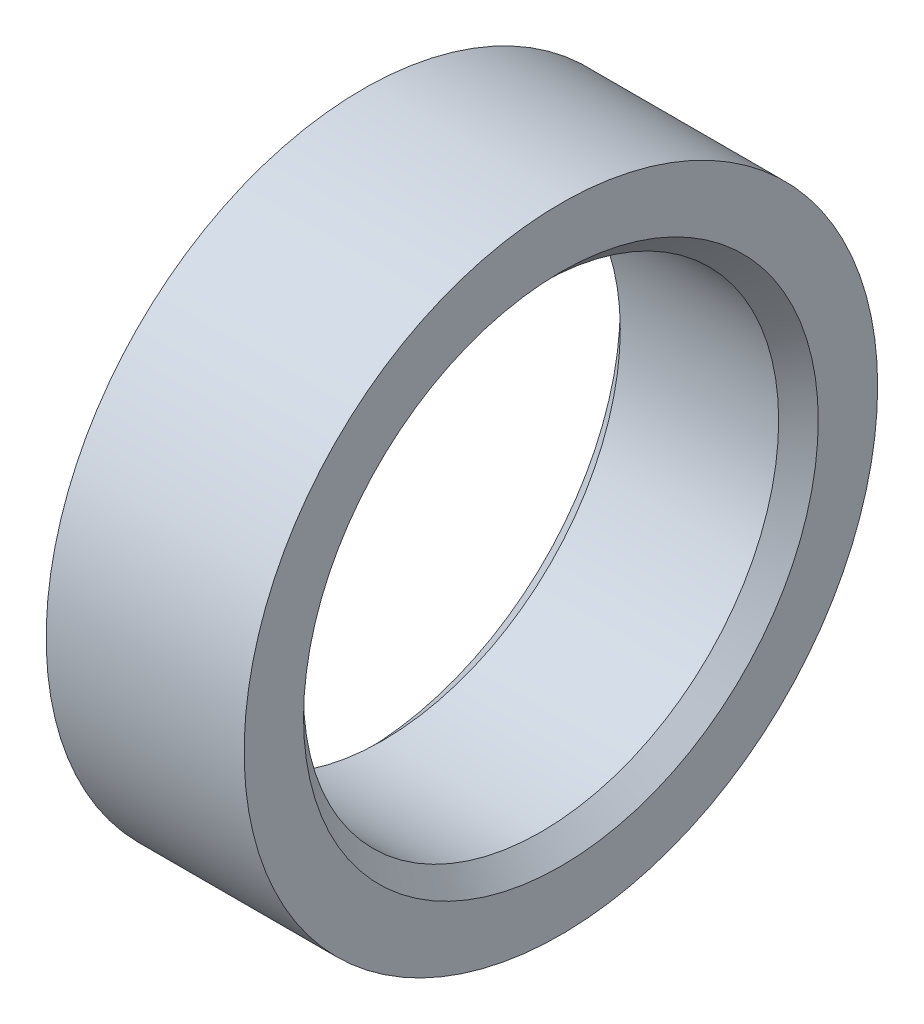
ISO-10303-21;
HEADER;
FILE_DESCRIPTION(('STEP AP214'),'2;1');
FILE_NAME('part.step','',(''),(''),'','','');
FILE_SCHEMA(('AUTOMOTIVE_DESIGN { 1 0 10303 214 1 1 1 1 }'));
ENDSEC;
DATA;
#1=APPLICATION_CONTEXT('core data for automotive mechanical design processes');
#2=APPLICATION_PROTOCOL_DEFINITION('international standard','automotive_design',2000,#1);
#3=PRODUCT_CONTEXT('',#1,'mechanical');
#4=PRODUCT('Part','Part','',(#3));
#5=PRODUCT_RELATED_PRODUCT_CATEGORY('part','',(#4));
#6=PRODUCT_DEFINITION_FORMATION('','',#4);
#7=PRODUCT_DEFINITION_CONTEXT('part definition',#1,'design');
#8=PRODUCT_DEFINITION('design','',#6,#7);
#9=PRODUCT_DEFINITION_SHAPE('','',#8);
#10=(LENGTH_UNIT() NAMED_UNIT(*) SI_UNIT(.MILLI.,.METRE.));
#11=(NAMED_UNIT(*) PLANE_ANGLE_UNIT() SI_UNIT($,.RADIAN.));
#12=(NAMED_UNIT(*) SI_UNIT($,.STERADIAN.) SOLID_ANGLE_UNIT());
#13=UNCERTAINTY_MEASURE_WITH_UNIT(LENGTH_MEASURE(1.E-05),#10,'distance_accuracy_value','');
#14=(GEOMETRIC_REPRESENTATION_CONTEXT(3) GLOBAL_UNCERTAINTY_ASSIGNED_CONTEXT((#13)) GLOBAL_UNIT_ASSIGNED_CONTEXT((#10,
#11,#12)) REPRESENTATION_CONTEXT('',''));
#15=CARTESIAN_POINT('',(0.,0.,0.));
#16=DIRECTION('',(0.,0.,1.));
#17=DIRECTION('',(1.,0.,0.));
#18=AXIS2_PLACEMENT_3D('',#15,#16,#17);
#19=CARTESIAN_POINT('',(5.,0.,0.));
#20=DIRECTION('',(1.,0.,0.));
#21=DIRECTION('',(0.,0.,-1.));
#22=AXIS2_PLACEMENT_3D('',#19,#20,#21);
#23=PLANE('',#22);
#24=CARTESIAN_POINT('',(5.,0.,0.));
#25=DIRECTION('',(1.,0.,0.));
#26=DIRECTION('',(0.,0.,-1.));
#27=AXIS2_PLACEMENT_3D('',#24,#25,#26);
#28=CIRCLE('',#27,6.5);
#29=CARTESIAN_POINT('',(5.,0.,-6.5));
#30=VERTEX_POINT('',#29);
#31=EDGE_CURVE('E10',#30,#30,#28,.F.);
#32=ORIENTED_EDGE('',*,*,#31,.T.);
#33=EDGE_LOOP('',(#32));
#34=FACE_BOUND('',#33,.T.);
#35=CARTESIAN_POINT('',(5.,0.,0.));
#36=DIRECTION('',(1.,0.,0.));
#37=DIRECTION('',(0.,0.,-1.));
#38=AXIS2_PLACEMENT_3D('',#35,#36,#37);
#39=CIRCLE('',#38,8.);
#40=CARTESIAN_POINT('',(5.,0.,-8.));
#41=VERTEX_POINT('',#40);
#42=EDGE_CURVE('E51',#41,#41,#39,.T.);
#43=ORIENTED_EDGE('',*,*,#42,.T.);
#44=EDGE_LOOP('',(#43));
#45=FACE_BOUND('',#44,.T.);
#46=ADVANCED_FACE('F31',(#34,#45),#23,.T.);
#47=CARTESIAN_POINT('',(0.,0.,0.));
#48=DIRECTION('',(1.,0.,0.));
#49=DIRECTION('',(0.,0.,-1.));
#50=AXIS2_PLACEMENT_3D('',#47,#48,#49);
#51=PLANE('',#50);
#52=CARTESIAN_POINT('',(0.,0.,0.));
#53=DIRECTION('',(1.,0.,0.));
#54=DIRECTION('',(0.,0.,-1.));
#55=AXIS2_PLACEMENT_3D('',#52,#53,#54);
#56=CIRCLE('',#55,6.5);
#57=CARTESIAN_POINT('',(0.,0.,-6.5));
#58=VERTEX_POINT('',#57);
#59=EDGE_CURVE('E46',#58,#58,#56,.T.);
#60=ORIENTED_EDGE('',*,*,#59,.T.);
#61=EDGE_LOOP('',(#60));
#62=FACE_BOUND('',#61,.T.);
#63=CARTESIAN_POINT('',(0.,0.,0.));
#64=DIRECTION('',(1.,0.,0.));
#65=DIRECTION('',(0.,0.,-1.));
#66=AXIS2_PLACEMENT_3D('',#63,#64,#65);
#67=CIRCLE('',#66,8.);
#68=CARTESIAN_POINT('',(0.,0.,-8.));
#69=VERTEX_POINT('',#68);
#70=EDGE_CURVE('E52',#69,#69,#67,.T.);
#71=ORIENTED_EDGE('',*,*,#70,.F.);
#72=EDGE_LOOP('',(#71));
#73=FACE_BOUND('',#72,.T.);
#74=ADVANCED_FACE('F63',(#62,#73),#51,.F.);
#75=CARTESIAN_POINT('',(5.,0.,0.));
#76=DIRECTION('',(-1.,0.,0.));
#77=DIRECTION('',(0.,0.,1.));
#78=AXIS2_PLACEMENT_3D('',#75,#76,#77);
#79=CYLINDRICAL_SURFACE('',#78,8.);
#80=ORIENTED_EDGE('',*,*,#42,.F.);
#81=EDGE_LOOP('',(#80));
#82=FACE_BOUND('',#81,.T.);
#83=ORIENTED_EDGE('',*,*,#70,.T.);
#84=EDGE_LOOP('',(#83));
#85=FACE_BOUND('',#84,.T.);
#86=ADVANCED_FACE('F59',(#82,#85),#79,.T.);
#87=CARTESIAN_POINT('',(5.,0.,0.));
#88=DIRECTION('',(-1.,0.,0.));
#89=DIRECTION('',(0.,0.,1.));
#90=AXIS2_PLACEMENT_3D('',#87,#88,#89);
#91=CYLINDRICAL_SURFACE('',#90,6.);
#92=CARTESIAN_POINT('',(0.500000000000002,0.,0.));
#93=DIRECTION('',(1.,0.,0.));
#94=DIRECTION('',(0.,0.,-1.));
#95=AXIS2_PLACEMENT_3D('',#92,#93,#94);
#96=CIRCLE('',#95,6.);
#97=CARTESIAN_POINT('',(0.500000000000002,0.,-6.));
#98=VERTEX_POINT('',#97);
#99=EDGE_CURVE('E38',#98,#98,#96,.F.);
#100=ORIENTED_EDGE('',*,*,#99,.T.);
#101=EDGE_LOOP('',(#100));
#102=FACE_BOUND('',#101,.T.);
#103=CARTESIAN_POINT('',(4.5,0.,0.));
#104=DIRECTION('',(1.,0.,0.));
#105=DIRECTION('',(0.,0.,-1.));
#106=AXIS2_PLACEMENT_3D('',#103,#104,#105);
#107=CIRCLE('',#106,6.);
#108=CARTESIAN_POINT('',(4.5,0.,-6.));
#109=VERTEX_POINT('',#108);
#110=EDGE_CURVE('E42',#109,#109,#107,.T.);
#111=ORIENTED_EDGE('',*,*,#110,.T.);
#112=EDGE_LOOP('',(#111));
#113=FACE_BOUND('',#112,.T.);
#114=ADVANCED_FACE('F62',(#102,#113),#91,.F.);
#115=CARTESIAN_POINT('',(0.,0.,0.));
#116=DIRECTION('',(-1.,0.,0.));
#117=DIRECTION('',(0.,0.,1.));
#118=AXIS2_PLACEMENT_3D('',#115,#116,#117);
#119=CONICAL_SURFACE('',#118,6.5,0.785398163397444);
#120=ORIENTED_EDGE('',*,*,#99,.F.);
#121=EDGE_LOOP('',(#120));
#122=FACE_BOUND('',#121,.T.);
#123=ORIENTED_EDGE('',*,*,#59,.F.);
#124=EDGE_LOOP('',(#123));
#125=FACE_BOUND('',#124,.T.);
#126=ADVANCED_FACE('F75',(#122,#125),#119,.F.);
#127=CARTESIAN_POINT('',(4.5,0.,0.));
#128=DIRECTION('',(1.,0.,0.));
#129=DIRECTION('',(0.,0.,-1.));
#130=AXIS2_PLACEMENT_3D('',#127,#128,#129);
#131=CONICAL_SURFACE('',#130,6.,0.785398163397452);
#132=ORIENTED_EDGE('',*,*,#31,.F.);
#133=EDGE_LOOP('',(#132));
#134=FACE_BOUND('',#133,.T.);
#135=ORIENTED_EDGE('',*,*,#110,.F.);
#136=EDGE_LOOP('',(#135));
#137=FACE_BOUND('',#136,.T.);
#138=ADVANCED_FACE('F33',(#134,#137),#131,.F.);
#139=CLOSED_SHELL('',(#46,#74,#86,#114,#126,#138));
#140=MANIFOLD_SOLID_BREP('B2',#139);
#141=ADVANCED_BREP_SHAPE_REPRESENTATION('',(#18,#140),#14);
#142=SHAPE_DEFINITION_REPRESENTATION(#9,#141);
ENDSEC;
END-ISO-10303-21;
